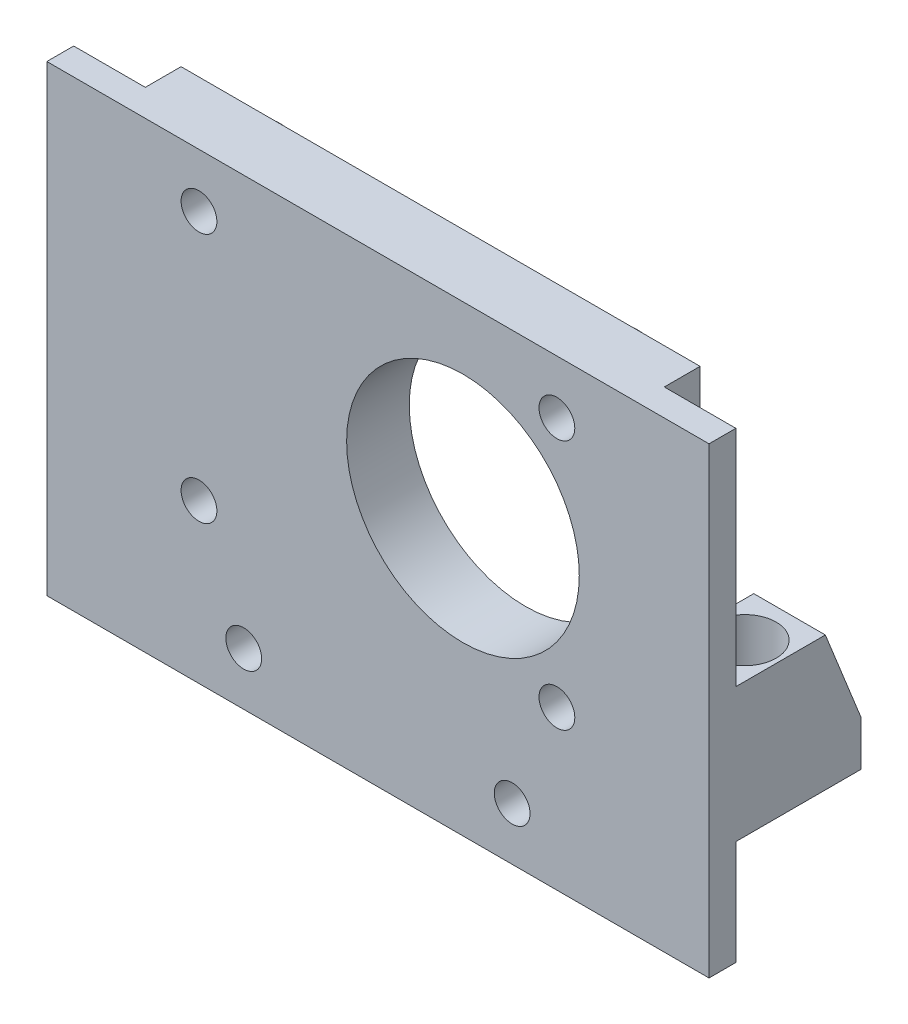
ISO-10303-21;
HEADER;
FILE_DESCRIPTION(('STEP AP214'),'2;1');
FILE_NAME('part.step','',(''),(''),'','','');
FILE_SCHEMA(('AUTOMOTIVE_DESIGN { 1 0 10303 214 1 1 1 1 }'));
ENDSEC;
DATA;
#1=APPLICATION_CONTEXT('core data for automotive mechanical design processes');
#2=APPLICATION_PROTOCOL_DEFINITION('international standard','automotive_design',2000,#1);
#3=PRODUCT_CONTEXT('',#1,'mechanical');
#4=PRODUCT('Part','Part','',(#3));
#5=PRODUCT_RELATED_PRODUCT_CATEGORY('part','',(#4));
#6=PRODUCT_DEFINITION_FORMATION('','',#4);
#7=PRODUCT_DEFINITION_CONTEXT('part definition',#1,'design');
#8=PRODUCT_DEFINITION('design','',#6,#7);
#9=PRODUCT_DEFINITION_SHAPE('','',#8);
#10=(LENGTH_UNIT() NAMED_UNIT(*) SI_UNIT(.MILLI.,.METRE.));
#11=(NAMED_UNIT(*) PLANE_ANGLE_UNIT() SI_UNIT($,.RADIAN.));
#12=(NAMED_UNIT(*) SI_UNIT($,.STERADIAN.) SOLID_ANGLE_UNIT());
#13=UNCERTAINTY_MEASURE_WITH_UNIT(LENGTH_MEASURE(1.E-05),#10,'distance_accuracy_value','');
#14=(GEOMETRIC_REPRESENTATION_CONTEXT(3) GLOBAL_UNCERTAINTY_ASSIGNED_CONTEXT((#13)) GLOBAL_UNIT_ASSIGNED_CONTEXT((#10,
#11,#12)) REPRESENTATION_CONTEXT('',''));
#15=CARTESIAN_POINT('',(0.,0.,0.));
#16=DIRECTION('',(0.,0.,1.));
#17=DIRECTION('',(1.,0.,0.));
#18=AXIS2_PLACEMENT_3D('',#15,#16,#17);
#19=CARTESIAN_POINT('',(0.,1.83595020953031,0.));
#20=DIRECTION('',(0.,-1.,0.));
#21=DIRECTION('',(0.,0.,-1.));
#22=AXIS2_PLACEMENT_3D('',#19,#20,#21);
#23=PLANE('',#22);
#24=CARTESIAN_POINT('',(-4.,1.83595020953031,1.03844798598296));
#25=DIRECTION('',(0.,-1.,0.));
#26=DIRECTION('',(0.,0.,-1.));
#27=AXIS2_PLACEMENT_3D('',#24,#25,#26);
#28=CIRCLE('',#27,2.);
#29=CARTESIAN_POINT('',(-4.,1.83595020953031,-0.961552014017035));
#30=VERTEX_POINT('',#29);
#31=EDGE_CURVE('E205',#30,#30,#28,.F.);
#32=ORIENTED_EDGE('',*,*,#31,.T.);
#33=EDGE_LOOP('',(#32));
#34=FACE_BOUND('',#33,.T.);
#35=DIRECTION('',(0.,0.,-1.));
#36=VECTOR('',#35,1.);
#37=CARTESIAN_POINT('',(0.,1.83595020953031,-1.96155201401704));
#38=LINE('',#37,#36);
#39=CARTESIAN_POINT('',(0.,1.83595020953031,2.03844798598298));
#40=VERTEX_POINT('',#39);
#41=CARTESIAN_POINT('',(0.,1.83595020953031,-3.96155201401702));
#42=VERTEX_POINT('',#41);
#43=EDGE_CURVE('E198',#40,#42,#38,.T.);
#44=ORIENTED_EDGE('',*,*,#43,.F.);
#45=DIRECTION('',(1.,0.,0.));
#46=VECTOR('',#45,1.);
#47=CARTESIAN_POINT('',(0.,1.83595020953034,2.03844798598298));
#48=LINE('',#47,#46);
#49=CARTESIAN_POINT('',(58.,1.83595020953031,2.03844798598298));
#50=VERTEX_POINT('',#49);
#51=EDGE_CURVE('E229',#40,#50,#48,.T.);
#52=ORIENTED_EDGE('',*,*,#51,.T.);
#53=DIRECTION('',(0.,0.,1.));
#54=VECTOR('',#53,1.);
#55=CARTESIAN_POINT('',(58.,1.83595020953031,6.03844798598335));
#56=LINE('',#55,#54);
#57=CARTESIAN_POINT('',(58.,1.83595020953031,-7.96155201401704));
#58=VERTEX_POINT('',#57);
#59=EDGE_CURVE('E296',#58,#50,#56,.T.);
#60=ORIENTED_EDGE('',*,*,#59,.F.);
#61=DIRECTION('',(-1.,0.,0.));
#62=VECTOR('',#61,1.);
#63=CARTESIAN_POINT('',(58.,1.83595020953031,-7.96155201401704));
#64=LINE('',#63,#62);
#65=CARTESIAN_POINT('',(66.,1.83595020953031,-7.96155201401704));
#66=VERTEX_POINT('',#65);
#67=EDGE_CURVE('E301',#66,#58,#64,.T.);
#68=ORIENTED_EDGE('',*,*,#67,.F.);
#69=DIRECTION('',(0.,0.,-1.));
#70=VECTOR('',#69,1.);
#71=CARTESIAN_POINT('',(66.,1.83595020953031,6.03844798598296));
#72=LINE('',#71,#70);
#73=CARTESIAN_POINT('',(66.,1.83595020953031,6.03844798598296));
#74=VERTEX_POINT('',#73);
#75=EDGE_CURVE('E304',#74,#66,#72,.T.);
#76=ORIENTED_EDGE('',*,*,#75,.F.);
#77=DIRECTION('',(1.,0.,0.));
#78=VECTOR('',#77,1.);
#79=CARTESIAN_POINT('',(0.,1.83595020953031,6.03844798598335));
#80=LINE('',#79,#78);
#81=CARTESIAN_POINT('',(-8.00000000000001,1.83595020953031,6.03844798598298));
#82=VERTEX_POINT('',#81);
#83=EDGE_CURVE('E314',#82,#74,#80,.T.);
#84=ORIENTED_EDGE('',*,*,#83,.F.);
#85=DIRECTION('',(0.,0.,1.));
#86=VECTOR('',#85,1.);
#87=CARTESIAN_POINT('',(-8.,1.83595020953031,-1.96155201401704));
#88=LINE('',#87,#86);
#89=CARTESIAN_POINT('',(-8.00000000000001,1.83595020953031,-3.96155201401702));
#90=VERTEX_POINT('',#89);
#91=EDGE_CURVE('E316',#90,#82,#88,.T.);
#92=ORIENTED_EDGE('',*,*,#91,.F.);
#93=DIRECTION('',(-1.,0.,0.));
#94=VECTOR('',#93,1.);
#95=CARTESIAN_POINT('',(0.,1.83595020953031,-3.96155201401702));
#96=LINE('',#95,#94);
#97=EDGE_CURVE('E194',#42,#90,#96,.T.);
#98=ORIENTED_EDGE('',*,*,#97,.F.);
#99=EDGE_LOOP('',(#44,#52,#60,#68,#76,#84,#92,#98));
#100=FACE_BOUND('',#99,.T.);
#101=CARTESIAN_POINT('',(62.0000000000001,1.83595020953031,1.03844798598296));
#102=DIRECTION('',(0.,1.,0.));
#103=DIRECTION('',(0.,0.,1.));
#104=AXIS2_PLACEMENT_3D('',#101,#102,#103);
#105=CIRCLE('',#104,2.);
#106=CARTESIAN_POINT('',(62.0000000000001,1.83595020953031,3.03844798598295));
#107=VERTEX_POINT('',#106);
#108=EDGE_CURVE('E293',#107,#107,#105,.T.);
#109=ORIENTED_EDGE('',*,*,#108,.T.);
#110=EDGE_LOOP('',(#109));
#111=FACE_BOUND('',#110,.T.);
#112=ADVANCED_FACE('F47',(#34,#100,#111),#23,.T.);
#113=CARTESIAN_POINT('',(58.,6.83595020953031,6.03844798598335));
#114=DIRECTION('',(1.,0.,0.));
#115=DIRECTION('',(0.,0.,-1.));
#116=AXIS2_PLACEMENT_3D('',#113,#114,#115);
#117=PLANE('',#116);
#118=DIRECTION('',(0.,0.,1.));
#119=VECTOR('',#118,1.);
#120=CARTESIAN_POINT('',(57.9999999999997,16.8359502095296,6.03844798598298));
#121=LINE('',#120,#119);
#122=CARTESIAN_POINT('',(57.9999999999997,16.8359502095296,-3.96155201401724));
#123=VERTEX_POINT('',#122);
#124=CARTESIAN_POINT('',(58.,16.8359502095296,2.03844798598298));
#125=VERTEX_POINT('',#124);
#126=EDGE_CURVE('E212',#123,#125,#121,.T.);
#127=ORIENTED_EDGE('',*,*,#126,.F.);
#128=DIRECTION('',(0.,-0.928476690885257,-0.371390676354111));
#129=VECTOR('',#128,1.);
#130=CARTESIAN_POINT('',(58.,6.83595020953031,-7.96155201401704));
#131=LINE('',#130,#129);
#132=CARTESIAN_POINT('',(58.,6.83595020953031,-7.96155201401704));
#133=VERTEX_POINT('',#132);
#134=EDGE_CURVE('E278',#123,#133,#131,.T.);
#135=ORIENTED_EDGE('',*,*,#134,.T.);
#136=DIRECTION('',(0.,-1.,0.));
#137=VECTOR('',#136,1.);
#138=CARTESIAN_POINT('',(58.,6.83595020953031,-7.96155201401704));
#139=LINE('',#138,#137);
#140=EDGE_CURVE('E300',#133,#58,#139,.T.);
#141=ORIENTED_EDGE('',*,*,#140,.T.);
#142=ORIENTED_EDGE('',*,*,#59,.T.);
#143=DIRECTION('',(0.,1.,0.));
#144=VECTOR('',#143,1.);
#145=CARTESIAN_POINT('',(58.,0.,2.03844798598298));
#146=LINE('',#145,#144);
#147=EDGE_CURVE('E232',#50,#125,#146,.T.);
#148=ORIENTED_EDGE('',*,*,#147,.T.);
#149=EDGE_LOOP('',(#127,#135,#141,#142,#148));
#150=FACE_BOUND('',#149,.T.);
#151=ADVANCED_FACE('F408',(#150),#117,.F.);
#152=CARTESIAN_POINT('',(20.3038463500591,6.83595020953031,-7.96155201401704));
#153=DIRECTION('',(0.,0.371390676354111,-0.928476690885257));
#154=DIRECTION('',(0.,0.928476690885257,0.371390676354111));
#155=AXIS2_PLACEMENT_3D('',#152,#153,#154);
#156=PLANE('',#155);
#157=ORIENTED_EDGE('',*,*,#134,.F.);
#158=DIRECTION('',(1.,0.,0.));
#159=VECTOR('',#158,1.);
#160=CARTESIAN_POINT('',(20.3038463500591,16.8359502095296,-3.96155201401724));
#161=LINE('',#160,#159);
#162=CARTESIAN_POINT('',(66.,16.8359502095296,-3.96155201401724));
#163=VERTEX_POINT('',#162);
#164=EDGE_CURVE('E221',#123,#163,#161,.T.);
#165=ORIENTED_EDGE('',*,*,#164,.T.);
#166=DIRECTION('',(0.,0.928476690885257,0.371390676354111));
#167=VECTOR('',#166,1.);
#168=CARTESIAN_POINT('',(66.,6.83595020953031,-7.96155201401704));
#169=LINE('',#168,#167);
#170=CARTESIAN_POINT('',(66.,6.83595020953031,-7.96155201401704));
#171=VERTEX_POINT('',#170);
#172=EDGE_CURVE('E267',#171,#163,#169,.T.);
#173=ORIENTED_EDGE('',*,*,#172,.F.);
#174=DIRECTION('',(-1.,0.,0.));
#175=VECTOR('',#174,1.);
#176=CARTESIAN_POINT('',(58.,6.83595020953031,-7.96155201401704));
#177=LINE('',#176,#175);
#178=EDGE_CURVE('E297',#171,#133,#177,.T.);
#179=ORIENTED_EDGE('',*,*,#178,.T.);
#180=EDGE_LOOP('',(#157,#165,#173,#179));
#181=FACE_BOUND('',#180,.T.);
#182=ADVANCED_FACE('F414',(#181),#156,.T.);
#183=CARTESIAN_POINT('',(62.0000000000001,41.8359502095296,1.03844798598296));
#184=DIRECTION('',(0.,-1.,0.));
#185=DIRECTION('',(0.,0.,-1.));
#186=AXIS2_PLACEMENT_3D('',#183,#184,#185);
#187=CYLINDRICAL_SURFACE('',#186,3.50000000000001);
#188=CARTESIAN_POINT('',(62.0000000000001,7.83595020953031,1.03844798598296));
#189=DIRECTION('',(0.,-1.,0.));
#190=DIRECTION('',(0.,0.,-1.));
#191=AXIS2_PLACEMENT_3D('',#188,#189,#190);
#192=CIRCLE('',#191,3.50000000000001);
#193=CARTESIAN_POINT('',(62.0000000000001,7.83595020953031,-2.46155201401705));
#194=VERTEX_POINT('',#193);
#195=EDGE_CURVE('E256',#194,#194,#192,.T.);
#196=ORIENTED_EDGE('',*,*,#195,.T.);
#197=EDGE_LOOP('',(#196));
#198=FACE_BOUND('',#197,.T.);
#199=CARTESIAN_POINT('',(62.0000000000001,16.8359502095296,1.03844798598296));
#200=DIRECTION('',(0.,1.,0.));
#201=DIRECTION('',(0.,0.,1.));
#202=AXIS2_PLACEMENT_3D('',#199,#200,#201);
#203=CIRCLE('',#202,3.50000000000001);
#204=CARTESIAN_POINT('',(62.0000000000001,16.8359502095296,4.53844798598296));
#205=VERTEX_POINT('',#204);
#206=EDGE_CURVE('E51',#205,#205,#203,.F.);
#207=ORIENTED_EDGE('',*,*,#206,.F.);
#208=EDGE_LOOP('',(#207));
#209=FACE_BOUND('',#208,.T.);
#210=ADVANCED_FACE('F540',(#198,#209),#187,.F.);
#211=CARTESIAN_POINT('',(0.,0.,6.03844798598298));
#212=DIRECTION('',(0.,0.,1.));
#213=DIRECTION('',(1.,0.,0.));
#214=AXIS2_PLACEMENT_3D('',#211,#212,#213);
#215=PLANE('',#214);
#216=DIRECTION('',(1.,0.,0.));
#217=VECTOR('',#216,1.);
#218=CARTESIAN_POINT('',(0.,41.8359502095296,6.03844798598298));
#219=LINE('',#218,#217);
#220=CARTESIAN_POINT('',(-8.00000000000001,41.8359502095296,6.03844798598298));
#221=VERTEX_POINT('',#220);
#222=CARTESIAN_POINT('',(0.,41.8359502095296,6.03844798598298));
#223=VERTEX_POINT('',#222);
#224=EDGE_CURVE('E355',#221,#223,#219,.T.);
#225=ORIENTED_EDGE('',*,*,#224,.T.);
#226=DIRECTION('',(0.,1.,0.));
#227=VECTOR('',#226,1.);
#228=CARTESIAN_POINT('',(0.,0.,6.03844798598298));
#229=LINE('',#228,#227);
#230=CARTESIAN_POINT('',(0.,14.993789145251,6.03844798598298));
#231=VERTEX_POINT('',#230);
#232=EDGE_CURVE('E71',#231,#223,#229,.T.);
#233=ORIENTED_EDGE('',*,*,#232,.F.);
#234=DIRECTION('',(-1.,0.,0.));
#235=VECTOR('',#234,1.);
#236=CARTESIAN_POINT('',(11.4258625976842,14.993789145251,6.03844798598297));
#237=LINE('',#236,#235);
#238=CARTESIAN_POINT('',(-8.00000000000001,14.993789145251,6.03844798598298));
#239=VERTEX_POINT('',#238);
#240=EDGE_CURVE('E272',#231,#239,#237,.T.);
#241=ORIENTED_EDGE('',*,*,#240,.T.);
#242=DIRECTION('',(0.,1.,0.));
#243=VECTOR('',#242,1.);
#244=CARTESIAN_POINT('',(-8.00000000000001,0.,6.03844798598298));
#245=LINE('',#244,#243);
#246=EDGE_CURVE('E357',#239,#221,#245,.T.);
#247=ORIENTED_EDGE('',*,*,#246,.T.);
#248=EDGE_LOOP('',(#225,#233,#241,#247));
#249=FACE_BOUND('',#248,.T.);
#250=ADVANCED_FACE('F401',(#249),#215,.F.);
#251=CARTESIAN_POINT('',(49.,35.8359502095322,17.3521564849678));
#252=DIRECTION('',(0.,0.,-1.));
#253=DIRECTION('',(-1.,0.,0.));
#254=AXIS2_PLACEMENT_3D('',#251,#252,#253);
#255=CYLINDRICAL_SURFACE('',#254,4.00000000000001);
#256=CARTESIAN_POINT('',(49.,35.8359502095322,0.));
#257=DIRECTION('',(0.,0.,1.));
#258=DIRECTION('',(1.,0.,0.));
#259=AXIS2_PLACEMENT_3D('',#256,#257,#258);
#260=CIRCLE('',#259,4.00000000000001);
#261=CARTESIAN_POINT('',(53.,35.8359502095322,0.));
#262=VERTEX_POINT('',#261);
#263=EDGE_CURVE('E370',#262,#262,#260,.T.);
#264=ORIENTED_EDGE('',*,*,#263,.T.);
#265=EDGE_LOOP('',(#264));
#266=FACE_BOUND('',#265,.T.);
#267=CARTESIAN_POINT('',(49.,35.8359502095322,2.03844798598298));
#268=DIRECTION('',(0.,0.,1.));
#269=DIRECTION('',(1.,0.,0.));
#270=AXIS2_PLACEMENT_3D('',#267,#268,#269);
#271=CIRCLE('',#270,4.00000000000001);
#272=CARTESIAN_POINT('',(53.,35.8359502095322,2.03844798598298));
#273=VERTEX_POINT('',#272);
#274=EDGE_CURVE('E12',#273,#273,#271,.T.);
#275=ORIENTED_EDGE('',*,*,#274,.F.);
#276=EDGE_LOOP('',(#275));
#277=FACE_BOUND('',#276,.T.);
#278=ADVANCED_FACE('F49',(#266,#277),#255,.T.);
#279=CARTESIAN_POINT('',(0.,6.83595020953031,-1.96155201401704));
#280=DIRECTION('',(-1.,0.,0.));
#281=DIRECTION('',(0.,0.,1.));
#282=AXIS2_PLACEMENT_3D('',#279,#280,#281);
#283=PLANE('',#282);
#284=DIRECTION('',(0.,0.713980136377104,0.700165955226996));
#285=VECTOR('',#284,1.);
#286=CARTESIAN_POINT('',(0.,6.83595020953031,-1.96155201401703));
#287=LINE('',#286,#285);
#288=CARTESIAN_POINT('',(0.,6.83595020953031,-1.96155201401704));
#289=VERTEX_POINT('',#288);
#290=CARTESIAN_POINT('',(0.,10.9148696773906,2.03844798598298));
#291=VERTEX_POINT('',#290);
#292=EDGE_CURVE('E265',#289,#291,#287,.T.);
#293=ORIENTED_EDGE('',*,*,#292,.T.);
#294=DIRECTION('',(0.,1.,0.));
#295=VECTOR('',#294,1.);
#296=CARTESIAN_POINT('',(0.,6.83595020953031,2.03844798598298));
#297=LINE('',#296,#295);
#298=EDGE_CURVE('E242',#40,#291,#297,.T.);
#299=ORIENTED_EDGE('',*,*,#298,.F.);
#300=ORIENTED_EDGE('',*,*,#43,.T.);
#301=DIRECTION('',(0.,-1.,0.));
#302=VECTOR('',#301,1.);
#303=CARTESIAN_POINT('',(0.,1.83595020953031,-3.96155201401702));
#304=LINE('',#303,#302);
#305=CARTESIAN_POINT('',(0.,6.83595020953031,-3.96155201401702));
#306=VERTEX_POINT('',#305);
#307=EDGE_CURVE('E186',#306,#42,#304,.T.);
#308=ORIENTED_EDGE('',*,*,#307,.F.);
#309=DIRECTION('',(0.,0.,-1.));
#310=VECTOR('',#309,1.);
#311=CARTESIAN_POINT('',(0.,6.83595020953031,6.03844798598298));
#312=LINE('',#311,#310);
#313=EDGE_CURVE('E175',#289,#306,#312,.T.);
#314=ORIENTED_EDGE('',*,*,#313,.F.);
#315=EDGE_LOOP('',(#293,#299,#300,#308,#314));
#316=FACE_BOUND('',#315,.T.);
#317=ADVANCED_FACE('F196',(#316),#283,.F.);
#318=CARTESIAN_POINT('',(-4.,6.83595020953031,1.03844798598296));
#319=DIRECTION('',(0.,-1.,0.));
#320=DIRECTION('',(0.,0.,-1.));
#321=AXIS2_PLACEMENT_3D('',#318,#319,#320);
#322=CYLINDRICAL_SURFACE('',#321,2.);
#323=CARTESIAN_POINT('',(-4.,7.83595020953031,1.03844798598296));
#324=DIRECTION('',(0.,-1.,0.));
#325=DIRECTION('',(0.,0.,-1.));
#326=AXIS2_PLACEMENT_3D('',#323,#324,#325);
#327=CIRCLE('',#326,2.);
#328=CARTESIAN_POINT('',(-4.,7.83595020953031,-0.961552014017035));
#329=VERTEX_POINT('',#328);
#330=EDGE_CURVE('E259',#329,#329,#327,.T.);
#331=ORIENTED_EDGE('',*,*,#330,.F.);
#332=EDGE_LOOP('',(#331));
#333=FACE_BOUND('',#332,.T.);
#334=ORIENTED_EDGE('',*,*,#31,.F.);
#335=EDGE_LOOP('',(#334));
#336=FACE_BOUND('',#335,.T.);
#337=ADVANCED_FACE('F391',(#333,#336),#322,.F.);
#338=CARTESIAN_POINT('',(62.0000000000001,6.83595020953031,1.03844798598296));
#339=DIRECTION('',(0.,-1.,0.));
#340=DIRECTION('',(0.,0.,-1.));
#341=AXIS2_PLACEMENT_3D('',#338,#339,#340);
#342=CYLINDRICAL_SURFACE('',#341,2.);
#343=ORIENTED_EDGE('',*,*,#108,.F.);
#344=EDGE_LOOP('',(#343));
#345=FACE_BOUND('',#344,.T.);
#346=CARTESIAN_POINT('',(62.0000000000001,7.83595020953031,1.03844798598296));
#347=DIRECTION('',(0.,-1.,0.));
#348=DIRECTION('',(0.,0.,-1.));
#349=AXIS2_PLACEMENT_3D('',#346,#347,#348);
#350=CIRCLE('',#349,2.);
#351=CARTESIAN_POINT('',(62.0000000000001,7.83595020953031,-0.961552014017039));
#352=VERTEX_POINT('',#351);
#353=EDGE_CURVE('E264',#352,#352,#350,.T.);
#354=ORIENTED_EDGE('',*,*,#353,.F.);
#355=EDGE_LOOP('',(#354));
#356=FACE_BOUND('',#355,.T.);
#357=ADVANCED_FACE('F388',(#345,#356),#342,.F.);
#358=CARTESIAN_POINT('',(44.,-3.96404979046968,6.03844798598298));
#359=DIRECTION('',(0.,0.,1.));
#360=DIRECTION('',(1.,0.,0.));
#361=AXIS2_PLACEMENT_3D('',#358,#359,#360);
#362=CIRCLE('',#361,2.);
#363=CARTESIAN_POINT('',(46.,-3.96404979046968,6.03844798598298));
#364=VERTEX_POINT('',#363);
#365=EDGE_CURVE('E982',#364,#364,#362,.T.);
#366=ORIENTED_EDGE('',*,*,#365,.T.);
#367=EDGE_LOOP('',(#366));
#368=FACE_BOUND('',#367,.T.);
#369=CARTESIAN_POINT('',(14.,-3.96404979046969,6.03844798598298));
#370=DIRECTION('',(0.,0.,1.));
#371=DIRECTION('',(1.,0.,0.));
#372=AXIS2_PLACEMENT_3D('',#369,#370,#371);
#373=CIRCLE('',#372,2.);
#374=CARTESIAN_POINT('',(16.,-3.96404979046969,6.03844798598298));
#375=VERTEX_POINT('',#374);
#376=EDGE_CURVE('E983',#375,#375,#373,.T.);
#377=ORIENTED_EDGE('',*,*,#376,.T.);
#378=EDGE_LOOP('',(#377));
#379=FACE_BOUND('',#378,.T.);
#380=ORIENTED_EDGE('',*,*,#83,.T.);
#381=DIRECTION('',(0.,1.,0.));
#382=VECTOR('',#381,1.);
#383=CARTESIAN_POINT('',(66.,0.,6.03844798598298));
#384=LINE('',#383,#382);
#385=CARTESIAN_POINT('',(66.,-9.86404979046969,6.03844798598298));
#386=VERTEX_POINT('',#385);
#387=EDGE_CURVE('E352',#386,#74,#384,.T.);
#388=ORIENTED_EDGE('',*,*,#387,.F.);
#389=DIRECTION('',(1.,0.,0.));
#390=VECTOR('',#389,1.);
#391=CARTESIAN_POINT('',(0.,-9.86404979046969,6.03844798598298));
#392=LINE('',#391,#390);
#393=CARTESIAN_POINT('',(-8.,-9.86404979046969,6.03844798598298));
#394=VERTEX_POINT('',#393);
#395=EDGE_CURVE('E336',#394,#386,#392,.T.);
#396=ORIENTED_EDGE('',*,*,#395,.F.);
#397=EDGE_CURVE('E341',#394,#82,#245,.T.);
#398=ORIENTED_EDGE('',*,*,#397,.T.);
#399=EDGE_LOOP('',(#380,#388,#396,#398));
#400=FACE_BOUND('',#399,.T.);
#401=ADVANCED_FACE('F390',(#368,#379,#400),#215,.F.);
#402=CARTESIAN_POINT('',(49.,35.8359502095322,17.3521564849678));
#403=DIRECTION('',(0.,0.,-1.));
#404=DIRECTION('',(-1.,0.,0.));
#405=AXIS2_PLACEMENT_3D('',#402,#403,#404);
#406=CYLINDRICAL_SURFACE('',#405,2.);
#407=CARTESIAN_POINT('',(49.,35.8359502095322,0.));
#408=DIRECTION('',(0.,0.,1.));
#409=DIRECTION('',(1.,0.,0.));
#410=AXIS2_PLACEMENT_3D('',#407,#408,#409);
#411=CIRCLE('',#410,2.);
#412=CARTESIAN_POINT('',(51.,35.8359502095322,0.));
#413=VERTEX_POINT('',#412);
#414=EDGE_CURVE('E373',#413,#413,#411,.T.);
#415=ORIENTED_EDGE('',*,*,#414,.F.);
#416=EDGE_LOOP('',(#415));
#417=FACE_BOUND('',#416,.T.);
#418=CARTESIAN_POINT('',(49.,35.8359502095322,9.03844798598298));
#419=DIRECTION('',(0.,0.,1.));
#420=DIRECTION('',(1.,0.,0.));
#421=AXIS2_PLACEMENT_3D('',#418,#419,#420);
#422=CIRCLE('',#421,2.);
#423=CARTESIAN_POINT('',(51.,35.8359502095322,9.03844798598298));
#424=VERTEX_POINT('',#423);
#425=EDGE_CURVE('E289',#424,#424,#422,.F.);
#426=ORIENTED_EDGE('',*,*,#425,.F.);
#427=EDGE_LOOP('',(#426));
#428=FACE_BOUND('',#427,.T.);
#429=ADVANCED_FACE('F398',(#417,#428),#406,.F.);
#430=CARTESIAN_POINT('',(0.,0.,0.));
#431=DIRECTION('',(0.,0.,1.));
#432=DIRECTION('',(1.,0.,0.));
#433=AXIS2_PLACEMENT_3D('',#430,#431,#432);
#434=PLANE('',#433);
#435=ORIENTED_EDGE('',*,*,#414,.T.);
#436=EDGE_LOOP('',(#435));
#437=FACE_BOUND('',#436,.T.);
#438=ORIENTED_EDGE('',*,*,#263,.F.);
#439=EDGE_LOOP('',(#438));
#440=FACE_BOUND('',#439,.T.);
#441=ADVANCED_FACE('F465',(#437,#440),#434,.F.);
#442=CARTESIAN_POINT('',(0.,0.,9.03844798598298));
#443=DIRECTION('',(0.,0.,1.));
#444=DIRECTION('',(1.,0.,0.));
#445=AXIS2_PLACEMENT_3D('',#442,#443,#444);
#446=PLANE('',#445);
#447=CARTESIAN_POINT('',(44.,-3.96404979046968,9.03844798598298));
#448=DIRECTION('',(0.,0.,1.));
#449=DIRECTION('',(1.,0.,0.));
#450=AXIS2_PLACEMENT_3D('',#447,#448,#449);
#451=CIRCLE('',#450,2.);
#452=CARTESIAN_POINT('',(46.,-3.96404979046968,9.03844798598298));
#453=VERTEX_POINT('',#452);
#454=EDGE_CURVE('E979',#453,#453,#451,.T.);
#455=ORIENTED_EDGE('',*,*,#454,.F.);
#456=EDGE_LOOP('',(#455));
#457=FACE_BOUND('',#456,.T.);
#458=CARTESIAN_POINT('',(14.,-3.96404979046969,9.03844798598298));
#459=DIRECTION('',(0.,0.,1.));
#460=DIRECTION('',(1.,0.,0.));
#461=AXIS2_PLACEMENT_3D('',#458,#459,#460);
#462=CIRCLE('',#461,2.);
#463=CARTESIAN_POINT('',(16.,-3.96404979046969,9.03844798598298));
#464=VERTEX_POINT('',#463);
#465=EDGE_CURVE('E988',#464,#464,#462,.T.);
#466=ORIENTED_EDGE('',*,*,#465,.F.);
#467=EDGE_LOOP('',(#466));
#468=FACE_BOUND('',#467,.T.);
#469=CARTESIAN_POINT('',(9.,7.8359502095322,9.03844798598298));
#470=DIRECTION('',(0.,0.,1.));
#471=DIRECTION('',(1.,0.,0.));
#472=AXIS2_PLACEMENT_3D('',#469,#470,#471);
#473=CIRCLE('',#472,2.);
#474=CARTESIAN_POINT('',(11.,7.8359502095322,9.03844798598298));
#475=VERTEX_POINT('',#474);
#476=EDGE_CURVE('E283',#475,#475,#473,.F.);
#477=ORIENTED_EDGE('',*,*,#476,.T.);
#478=EDGE_LOOP('',(#477));
#479=FACE_BOUND('',#478,.T.);
#480=CARTESIAN_POINT('',(49.,7.8359502095322,9.03844798598298));
#481=DIRECTION('',(0.,0.,1.));
#482=DIRECTION('',(1.,0.,0.));
#483=AXIS2_PLACEMENT_3D('',#480,#481,#482);
#484=CIRCLE('',#483,2.);
#485=CARTESIAN_POINT('',(51.,7.8359502095322,9.03844798598298));
#486=VERTEX_POINT('',#485);
#487=EDGE_CURVE('E286',#486,#486,#484,.F.);
#488=ORIENTED_EDGE('',*,*,#487,.T.);
#489=EDGE_LOOP('',(#488));
#490=FACE_BOUND('',#489,.T.);
#491=CARTESIAN_POINT('',(38.5,21.8359502095322,9.03844798598298));
#492=DIRECTION('',(0.,0.,1.));
#493=DIRECTION('',(1.,0.,0.));
#494=AXIS2_PLACEMENT_3D('',#491,#492,#493);
#495=CIRCLE('',#494,13.);
#496=CARTESIAN_POINT('',(51.5,21.8359502095322,9.03844798598298));
#497=VERTEX_POINT('',#496);
#498=EDGE_CURVE('E292',#497,#497,#495,.F.);
#499=ORIENTED_EDGE('',*,*,#498,.T.);
#500=EDGE_LOOP('',(#499));
#501=FACE_BOUND('',#500,.T.);
#502=ORIENTED_EDGE('',*,*,#425,.T.);
#503=EDGE_LOOP('',(#502));
#504=FACE_BOUND('',#503,.T.);
#505=CARTESIAN_POINT('',(9.,35.8359502095322,9.03844798598298));
#506=DIRECTION('',(0.,0.,1.));
#507=DIRECTION('',(1.,0.,0.));
#508=AXIS2_PLACEMENT_3D('',#505,#506,#507);
#509=CIRCLE('',#508,2.);
#510=CARTESIAN_POINT('',(11.,35.8359502095322,9.03844798598298));
#511=VERTEX_POINT('',#510);
#512=EDGE_CURVE('E280',#511,#511,#509,.F.);
#513=ORIENTED_EDGE('',*,*,#512,.T.);
#514=EDGE_LOOP('',(#513));
#515=FACE_BOUND('',#514,.T.);
#516=DIRECTION('',(1.,0.,0.));
#517=VECTOR('',#516,1.);
#518=CARTESIAN_POINT('',(0.,-9.86404979046969,9.03844798598298));
#519=LINE('',#518,#517);
#520=CARTESIAN_POINT('',(-8.,-9.86404979046969,9.03844798598298));
#521=VERTEX_POINT('',#520);
#522=CARTESIAN_POINT('',(66.,-9.86404979046969,9.03844798598298));
#523=VERTEX_POINT('',#522);
#524=EDGE_CURVE('E337',#521,#523,#519,.T.);
#525=ORIENTED_EDGE('',*,*,#524,.T.);
#526=DIRECTION('',(0.,1.,0.));
#527=VECTOR('',#526,1.);
#528=CARTESIAN_POINT('',(66.,0.,9.03844798598298));
#529=LINE('',#528,#527);
#530=CARTESIAN_POINT('',(66.,41.8359502095296,9.03844798598298));
#531=VERTEX_POINT('',#530);
#532=EDGE_CURVE('E340',#523,#531,#529,.T.);
#533=ORIENTED_EDGE('',*,*,#532,.T.);
#534=DIRECTION('',(1.,0.,0.));
#535=VECTOR('',#534,1.);
#536=CARTESIAN_POINT('',(0.,41.8359502095296,9.03844798598298));
#537=LINE('',#536,#535);
#538=CARTESIAN_POINT('',(-8.00000000000001,41.8359502095296,9.03844798598298));
#539=VERTEX_POINT('',#538);
#540=EDGE_CURVE('E343',#539,#531,#537,.T.);
#541=ORIENTED_EDGE('',*,*,#540,.F.);
#542=DIRECTION('',(0.,1.,0.));
#543=VECTOR('',#542,1.);
#544=CARTESIAN_POINT('',(-8.00000000000001,0.,9.03844798598298));
#545=LINE('',#544,#543);
#546=EDGE_CURVE('E346',#521,#539,#545,.T.);
#547=ORIENTED_EDGE('',*,*,#546,.F.);
#548=EDGE_LOOP('',(#525,#533,#541,#547));
#549=FACE_BOUND('',#548,.T.);
#550=ADVANCED_FACE('F462',(#457,#468,#479,#490,#501,#504,#515,#549),#446,.T.);
#551=CARTESIAN_POINT('',(-8.00000000000001,0.,9.03844798598298));
#552=DIRECTION('',(-1.,0.,0.));
#553=DIRECTION('',(0.,0.,1.));
#554=AXIS2_PLACEMENT_3D('',#551,#552,#553);
#555=PLANE('',#554);
#556=ORIENTED_EDGE('',*,*,#91,.T.);
#557=ORIENTED_EDGE('',*,*,#397,.F.);
#558=DIRECTION('',(0.,0.,-1.));
#559=VECTOR('',#558,1.);
#560=CARTESIAN_POINT('',(-8.,-9.86404979046969,9.03844798598298));
#561=LINE('',#560,#559);
#562=EDGE_CURVE('E349',#521,#394,#561,.T.);
#563=ORIENTED_EDGE('',*,*,#562,.F.);
#564=ORIENTED_EDGE('',*,*,#546,.T.);
#565=DIRECTION('',(0.,0.,-1.));
#566=VECTOR('',#565,1.);
#567=CARTESIAN_POINT('',(-8.00000000000001,41.8359502095296,9.03844798598298));
#568=LINE('',#567,#566);
#569=EDGE_CURVE('E361',#539,#221,#568,.T.);
#570=ORIENTED_EDGE('',*,*,#569,.T.);
#571=ORIENTED_EDGE('',*,*,#246,.F.);
#572=DIRECTION('',(0.,-0.713980136377104,-0.700165955226996));
#573=VECTOR('',#572,1.);
#574=CARTESIAN_POINT('',(-8.00000000000001,6.83595020953031,-1.96155201401704));
#575=LINE('',#574,#573);
#576=CARTESIAN_POINT('',(-8.00000000000001,6.83595020953031,-1.96155201401704));
#577=VERTEX_POINT('',#576);
#578=EDGE_CURVE('E269',#239,#577,#575,.T.);
#579=ORIENTED_EDGE('',*,*,#578,.T.);
#580=DIRECTION('',(0.,0.,-1.));
#581=VECTOR('',#580,1.);
#582=CARTESIAN_POINT('',(-8.00000000000001,6.83595020953031,6.03844798598298));
#583=LINE('',#582,#581);
#584=CARTESIAN_POINT('',(-8.00000000000001,6.83595020953031,-3.96155201401702));
#585=VERTEX_POINT('',#584);
#586=EDGE_CURVE('E203',#577,#585,#583,.T.);
#587=ORIENTED_EDGE('',*,*,#586,.T.);
#588=DIRECTION('',(0.,-1.,0.));
#589=VECTOR('',#588,1.);
#590=CARTESIAN_POINT('',(-8.00000000000001,1.83595020953031,-3.96155201401702));
#591=LINE('',#590,#589);
#592=EDGE_CURVE('E187',#585,#90,#591,.T.);
#593=ORIENTED_EDGE('',*,*,#592,.T.);
#594=EDGE_LOOP('',(#556,#557,#563,#564,#570,#571,#579,#587,#593));
#595=FACE_BOUND('',#594,.T.);
#596=ADVANCED_FACE('F464',(#595),#555,.T.);
#597=CARTESIAN_POINT('',(0.,41.8359502095296,9.03844798598298));
#598=DIRECTION('',(0.,1.,0.));
#599=DIRECTION('',(0.,0.,1.));
#600=AXIS2_PLACEMENT_3D('',#597,#598,#599);
#601=PLANE('',#600);
#602=ORIENTED_EDGE('',*,*,#224,.F.);
#603=ORIENTED_EDGE('',*,*,#569,.F.);
#604=ORIENTED_EDGE('',*,*,#540,.T.);
#605=DIRECTION('',(0.,0.,-1.));
#606=VECTOR('',#605,1.);
#607=CARTESIAN_POINT('',(66.,41.8359502095296,9.03844798598298));
#608=LINE('',#607,#606);
#609=CARTESIAN_POINT('',(66.,41.8359502095296,6.03844798598298));
#610=VERTEX_POINT('',#609);
#611=EDGE_CURVE('E364',#531,#610,#608,.T.);
#612=ORIENTED_EDGE('',*,*,#611,.T.);
#613=DIRECTION('',(1.,0.,0.));
#614=VECTOR('',#613,1.);
#615=CARTESIAN_POINT('',(20.3038463500591,41.8359502095296,6.03844798598298));
#616=LINE('',#615,#614);
#617=CARTESIAN_POINT('',(57.9999999999997,41.8359502095296,6.03844798598298));
#618=VERTEX_POINT('',#617);
#619=EDGE_CURVE('E276',#618,#610,#616,.T.);
#620=ORIENTED_EDGE('',*,*,#619,.F.);
#621=DIRECTION('',(0.,0.,1.));
#622=VECTOR('',#621,1.);
#623=CARTESIAN_POINT('',(58.,41.8359502095296,2.03844798598298));
#624=LINE('',#623,#622);
#625=CARTESIAN_POINT('',(58.,41.8359502095296,2.03844798598298));
#626=VERTEX_POINT('',#625);
#627=EDGE_CURVE('E237',#626,#618,#624,.T.);
#628=ORIENTED_EDGE('',*,*,#627,.F.);
#629=DIRECTION('',(1.,0.,0.));
#630=VECTOR('',#629,1.);
#631=CARTESIAN_POINT('',(0.,41.8359502095296,2.03844798598298));
#632=LINE('',#631,#630);
#633=CARTESIAN_POINT('',(0.,41.8359502095296,2.03844798598298));
#634=VERTEX_POINT('',#633);
#635=EDGE_CURVE('E235',#634,#626,#632,.T.);
#636=ORIENTED_EDGE('',*,*,#635,.F.);
#637=DIRECTION('',(0.,0.,1.));
#638=VECTOR('',#637,1.);
#639=CARTESIAN_POINT('',(0.,41.8359502095296,2.03844798598298));
#640=LINE('',#639,#638);
#641=EDGE_CURVE('E239',#634,#223,#640,.T.);
#642=ORIENTED_EDGE('',*,*,#641,.T.);
#643=EDGE_LOOP('',(#602,#603,#604,#612,#620,#628,#636,#642));
#644=FACE_BOUND('',#643,.T.);
#645=ADVANCED_FACE('F470',(#644),#601,.T.);
#646=CARTESIAN_POINT('',(66.,0.,9.03844798598298));
#647=DIRECTION('',(-1.,0.,0.));
#648=DIRECTION('',(0.,0.,1.));
#649=AXIS2_PLACEMENT_3D('',#646,#647,#648);
#650=PLANE('',#649);
#651=DIRECTION('',(0.,0.,-1.));
#652=VECTOR('',#651,1.);
#653=CARTESIAN_POINT('',(66.,16.8359502095296,6.03844798598298));
#654=LINE('',#653,#652);
#655=CARTESIAN_POINT('',(66.,16.8359502095296,6.03844798598298));
#656=VERTEX_POINT('',#655);
#657=EDGE_CURVE('E207',#656,#163,#654,.T.);
#658=ORIENTED_EDGE('',*,*,#657,.F.);
#659=DIRECTION('',(0.,1.,0.));
#660=VECTOR('',#659,1.);
#661=CARTESIAN_POINT('',(66.,16.8359502095296,6.03844798598298));
#662=LINE('',#661,#660);
#663=EDGE_CURVE('E217',#656,#610,#662,.T.);
#664=ORIENTED_EDGE('',*,*,#663,.T.);
#665=ORIENTED_EDGE('',*,*,#611,.F.);
#666=ORIENTED_EDGE('',*,*,#532,.F.);
#667=DIRECTION('',(0.,0.,-1.));
#668=VECTOR('',#667,1.);
#669=CARTESIAN_POINT('',(66.,-9.86404979046969,9.03844798598298));
#670=LINE('',#669,#668);
#671=EDGE_CURVE('E367',#523,#386,#670,.T.);
#672=ORIENTED_EDGE('',*,*,#671,.T.);
#673=ORIENTED_EDGE('',*,*,#387,.T.);
#674=ORIENTED_EDGE('',*,*,#75,.T.);
#675=DIRECTION('',(0.,-1.,0.));
#676=VECTOR('',#675,1.);
#677=CARTESIAN_POINT('',(66.,6.83595020953031,-7.96155201401704));
#678=LINE('',#677,#676);
#679=EDGE_CURVE('E309',#171,#66,#678,.T.);
#680=ORIENTED_EDGE('',*,*,#679,.F.);
#681=ORIENTED_EDGE('',*,*,#172,.T.);
#682=EDGE_LOOP('',(#658,#664,#665,#666,#672,#673,#674,#680,#681));
#683=FACE_BOUND('',#682,.T.);
#684=ADVANCED_FACE('F474',(#683),#650,.F.);
#685=CARTESIAN_POINT('',(0.,-9.86404979046969,9.03844798598298));
#686=DIRECTION('',(0.,1.,0.));
#687=DIRECTION('',(0.,0.,1.));
#688=AXIS2_PLACEMENT_3D('',#685,#686,#687);
#689=PLANE('',#688);
#690=ORIENTED_EDGE('',*,*,#395,.T.);
#691=ORIENTED_EDGE('',*,*,#671,.F.);
#692=ORIENTED_EDGE('',*,*,#524,.F.);
#693=ORIENTED_EDGE('',*,*,#562,.T.);
#694=EDGE_LOOP('',(#690,#691,#692,#693));
#695=FACE_BOUND('',#694,.T.);
#696=ADVANCED_FACE('F456',(#695),#689,.F.);
#697=CARTESIAN_POINT('',(49.,7.8359502095322,17.3521564849678));
#698=DIRECTION('',(0.,0.,-1.));
#699=DIRECTION('',(-1.,0.,0.));
#700=AXIS2_PLACEMENT_3D('',#697,#698,#699);
#701=CYLINDRICAL_SURFACE('',#700,2.);
#702=ORIENTED_EDGE('',*,*,#487,.F.);
#703=EDGE_LOOP('',(#702));
#704=FACE_BOUND('',#703,.T.);
#705=CARTESIAN_POINT('',(49.,7.8359502095322,0.));
#706=DIRECTION('',(0.,0.,1.));
#707=DIRECTION('',(1.,0.,0.));
#708=AXIS2_PLACEMENT_3D('',#705,#706,#707);
#709=CIRCLE('',#708,2.);
#710=CARTESIAN_POINT('',(51.,7.8359502095322,0.));
#711=VERTEX_POINT('',#710);
#712=EDGE_CURVE('E333',#711,#711,#709,.T.);
#713=ORIENTED_EDGE('',*,*,#712,.F.);
#714=EDGE_LOOP('',(#713));
#715=FACE_BOUND('',#714,.T.);
#716=ADVANCED_FACE('F444',(#704,#715),#701,.F.);
#717=CARTESIAN_POINT('',(9.,7.8359502095322,17.3521564849678));
#718=DIRECTION('',(0.,0.,-1.));
#719=DIRECTION('',(-1.,0.,0.));
#720=AXIS2_PLACEMENT_3D('',#717,#718,#719);
#721=CYLINDRICAL_SURFACE('',#720,2.);
#722=ORIENTED_EDGE('',*,*,#476,.F.);
#723=EDGE_LOOP('',(#722));
#724=FACE_BOUND('',#723,.T.);
#725=CARTESIAN_POINT('',(9.,7.8359502095322,0.));
#726=DIRECTION('',(0.,0.,1.));
#727=DIRECTION('',(1.,0.,0.));
#728=AXIS2_PLACEMENT_3D('',#725,#726,#727);
#729=CIRCLE('',#728,2.);
#730=CARTESIAN_POINT('',(11.,7.8359502095322,0.));
#731=VERTEX_POINT('',#730);
#732=EDGE_CURVE('E327',#731,#731,#729,.T.);
#733=ORIENTED_EDGE('',*,*,#732,.F.);
#734=EDGE_LOOP('',(#733));
#735=FACE_BOUND('',#734,.T.);
#736=ADVANCED_FACE('F432',(#724,#735),#721,.F.);
#737=CARTESIAN_POINT('',(9.,35.8359502095322,17.3521564849678));
#738=DIRECTION('',(0.,0.,-1.));
#739=DIRECTION('',(-1.,0.,0.));
#740=AXIS2_PLACEMENT_3D('',#737,#738,#739);
#741=CYLINDRICAL_SURFACE('',#740,2.);
#742=ORIENTED_EDGE('',*,*,#512,.F.);
#743=EDGE_LOOP('',(#742));
#744=FACE_BOUND('',#743,.T.);
#745=CARTESIAN_POINT('',(9.,35.8359502095322,0.));
#746=DIRECTION('',(0.,0.,1.));
#747=DIRECTION('',(1.,0.,0.));
#748=AXIS2_PLACEMENT_3D('',#745,#746,#747);
#749=CIRCLE('',#748,2.);
#750=CARTESIAN_POINT('',(11.,35.8359502095322,0.));
#751=VERTEX_POINT('',#750);
#752=EDGE_CURVE('E321',#751,#751,#749,.T.);
#753=ORIENTED_EDGE('',*,*,#752,.F.);
#754=EDGE_LOOP('',(#753));
#755=FACE_BOUND('',#754,.T.);
#756=ADVANCED_FACE('F428',(#744,#755),#741,.F.);
#757=CARTESIAN_POINT('',(58.,6.83595020953031,-7.96155201401704));
#758=DIRECTION('',(0.,0.,1.));
#759=DIRECTION('',(1.,0.,0.));
#760=AXIS2_PLACEMENT_3D('',#757,#758,#759);
#761=PLANE('',#760);
#762=ORIENTED_EDGE('',*,*,#67,.T.);
#763=ORIENTED_EDGE('',*,*,#140,.F.);
#764=ORIENTED_EDGE('',*,*,#178,.F.);
#765=ORIENTED_EDGE('',*,*,#679,.T.);
#766=EDGE_LOOP('',(#762,#763,#764,#765));
#767=FACE_BOUND('',#766,.T.);
#768=ADVANCED_FACE('F431',(#767),#761,.F.);
#769=CARTESIAN_POINT('',(38.5,21.8359502095322,10.));
#770=DIRECTION('',(0.,0.,-1.));
#771=DIRECTION('',(-1.,0.,0.));
#772=AXIS2_PLACEMENT_3D('',#769,#770,#771);
#773=CYLINDRICAL_SURFACE('',#772,13.);
#774=ORIENTED_EDGE('',*,*,#498,.F.);
#775=EDGE_LOOP('',(#774));
#776=FACE_BOUND('',#775,.T.);
#777=CARTESIAN_POINT('',(38.5,21.8359502095322,2.03844798598298));
#778=DIRECTION('',(0.,0.,1.));
#779=DIRECTION('',(1.,0.,0.));
#780=AXIS2_PLACEMENT_3D('',#777,#778,#779);
#781=CIRCLE('',#780,13.);
#782=CARTESIAN_POINT('',(51.5,21.8359502095322,2.03844798598298));
#783=VERTEX_POINT('',#782);
#784=EDGE_CURVE('E224',#783,#783,#781,.F.);
#785=ORIENTED_EDGE('',*,*,#784,.T.);
#786=EDGE_LOOP('',(#785));
#787=FACE_BOUND('',#786,.T.);
#788=ADVANCED_FACE('F565',(#776,#787),#773,.F.);
#789=CARTESIAN_POINT('',(11.4258625976842,6.83595020953031,-1.96155201401704));
#790=DIRECTION('',(0.,0.700165955226996,-0.713980136377104));
#791=DIRECTION('',(0.,0.713980136377104,0.700165955226996));
#792=AXIS2_PLACEMENT_3D('',#789,#790,#791);
#793=PLANE('',#792);
#794=CARTESIAN_POINT('',(-4.,9.89513981042555,1.03844798598296));
#795=DIRECTION('',(0.,0.700165955226996,-0.713980136377104));
#796=DIRECTION('',(0.,-0.713980136377104,-0.700165955226996));
#797=AXIS2_PLACEMENT_3D('',#794,#795,#796);
#798=ELLIPSE('',#797,4.28469847413159,3.);
#799=CARTESIAN_POINT('',(-6.21861062968826,7.83595020953031,-0.980900144933117));
#800=VERTEX_POINT('',#799);
#801=CARTESIAN_POINT('',(-1.78138937031174,7.83595020953031,-0.980900144933117));
#802=VERTEX_POINT('',#801);
#803=EDGE_CURVE('E251',#800,#802,#798,.T.);
#804=ORIENTED_EDGE('',*,*,#803,.F.);
#805=DIRECTION('',(-1.,0.,0.));
#806=VECTOR('',#805,1.);
#807=CARTESIAN_POINT('',(11.4258625976842,7.83595020953031,-0.980900144933119));
#808=LINE('',#807,#806);
#809=EDGE_CURVE('E376',#802,#800,#808,.T.);
#810=ORIENTED_EDGE('',*,*,#809,.F.);
#811=EDGE_LOOP('',(#804,#810));
#812=FACE_BOUND('',#811,.T.);
#813=ORIENTED_EDGE('',*,*,#292,.F.);
#814=DIRECTION('',(-1.,0.,0.));
#815=VECTOR('',#814,1.);
#816=CARTESIAN_POINT('',(0.,6.83595020953031,-1.96155201401704));
#817=LINE('',#816,#815);
#818=EDGE_CURVE('E181',#289,#577,#817,.T.);
#819=ORIENTED_EDGE('',*,*,#818,.T.);
#820=ORIENTED_EDGE('',*,*,#578,.F.);
#821=ORIENTED_EDGE('',*,*,#240,.F.);
#822=EDGE_CURVE('E268',#291,#231,#287,.T.);
#823=ORIENTED_EDGE('',*,*,#822,.F.);
#824=EDGE_LOOP('',(#813,#819,#820,#821,#823));
#825=FACE_BOUND('',#824,.T.);
#826=ADVANCED_FACE('F536',(#812,#825),#793,.T.);
#827=CARTESIAN_POINT('',(-4.,41.8359502095296,1.03844798598296));
#828=DIRECTION('',(0.,-1.,0.));
#829=DIRECTION('',(0.,0.,-1.));
#830=AXIS2_PLACEMENT_3D('',#827,#828,#829);
#831=CYLINDRICAL_SURFACE('',#830,3.);
#832=ORIENTED_EDGE('',*,*,#803,.T.);
#833=CARTESIAN_POINT('',(-4.,7.83595020953031,1.03844798598296));
#834=DIRECTION('',(0.,-1.,0.));
#835=DIRECTION('',(0.,0.,-1.));
#836=AXIS2_PLACEMENT_3D('',#833,#834,#835);
#837=CIRCLE('',#836,3.);
#838=EDGE_CURVE('E246',#802,#800,#837,.T.);
#839=ORIENTED_EDGE('',*,*,#838,.T.);
#840=EDGE_LOOP('',(#832,#839));
#841=FACE_BOUND('',#840,.T.);
#842=ADVANCED_FACE('F559',(#841),#831,.F.);
#843=CARTESIAN_POINT('',(-4.,7.83595020953031,1.03844798598296));
#844=DIRECTION('',(0.,-1.,0.));
#845=DIRECTION('',(0.,0.,-1.));
#846=AXIS2_PLACEMENT_3D('',#843,#844,#845);
#847=PLANE('',#846);
#848=ORIENTED_EDGE('',*,*,#330,.T.);
#849=EDGE_LOOP('',(#848));
#850=FACE_BOUND('',#849,.T.);
#851=ORIENTED_EDGE('',*,*,#809,.T.);
#852=ORIENTED_EDGE('',*,*,#838,.F.);
#853=EDGE_LOOP('',(#851,#852));
#854=FACE_BOUND('',#853,.T.);
#855=ADVANCED_FACE('F556',(#850,#854),#847,.F.);
#856=CARTESIAN_POINT('',(62.0000000000001,7.83595020953031,1.03844798598296));
#857=DIRECTION('',(0.,-1.,0.));
#858=DIRECTION('',(0.,0.,-1.));
#859=AXIS2_PLACEMENT_3D('',#856,#857,#858);
#860=PLANE('',#859);
#861=ORIENTED_EDGE('',*,*,#353,.T.);
#862=EDGE_LOOP('',(#861));
#863=FACE_BOUND('',#862,.T.);
#864=ORIENTED_EDGE('',*,*,#195,.F.);
#865=EDGE_LOOP('',(#864));
#866=FACE_BOUND('',#865,.T.);
#867=ADVANCED_FACE('F385',(#863,#866),#860,.F.);
#868=CARTESIAN_POINT('',(58.,0.,2.03844798598298));
#869=DIRECTION('',(1.,0.,0.));
#870=DIRECTION('',(0.,0.,-1.));
#871=AXIS2_PLACEMENT_3D('',#868,#869,#870);
#872=PLANE('',#871);
#873=ORIENTED_EDGE('',*,*,#627,.T.);
#874=DIRECTION('',(0.,1.,0.));
#875=VECTOR('',#874,1.);
#876=CARTESIAN_POINT('',(57.9999999999997,16.8359502095296,6.03844798598298));
#877=LINE('',#876,#875);
#878=CARTESIAN_POINT('',(57.9999999999997,16.8359502095296,6.03844798598298));
#879=VERTEX_POINT('',#878);
#880=EDGE_CURVE('E216',#879,#618,#877,.T.);
#881=ORIENTED_EDGE('',*,*,#880,.F.);
#882=EDGE_CURVE('E210',#125,#879,#121,.T.);
#883=ORIENTED_EDGE('',*,*,#882,.F.);
#884=EDGE_CURVE('E63',#125,#626,#146,.T.);
#885=ORIENTED_EDGE('',*,*,#884,.T.);
#886=EDGE_LOOP('',(#873,#881,#883,#885));
#887=FACE_BOUND('',#886,.T.);
#888=ADVANCED_FACE('F529',(#887),#872,.T.);
#889=CARTESIAN_POINT('',(0.,0.,2.03844798598298));
#890=DIRECTION('',(1.,0.,0.));
#891=DIRECTION('',(0.,0.,-1.));
#892=AXIS2_PLACEMENT_3D('',#889,#890,#891);
#893=PLANE('',#892);
#894=ORIENTED_EDGE('',*,*,#641,.F.);
#895=DIRECTION('',(0.,1.,0.));
#896=VECTOR('',#895,1.);
#897=CARTESIAN_POINT('',(0.,0.,2.03844798598298));
#898=LINE('',#897,#896);
#899=EDGE_CURVE('E227',#291,#634,#898,.T.);
#900=ORIENTED_EDGE('',*,*,#899,.F.);
#901=ORIENTED_EDGE('',*,*,#822,.T.);
#902=ORIENTED_EDGE('',*,*,#232,.T.);
#903=EDGE_LOOP('',(#894,#900,#901,#902));
#904=FACE_BOUND('',#903,.T.);
#905=ADVANCED_FACE('F533',(#904),#893,.F.);
#906=CARTESIAN_POINT('',(0.,0.,2.03844798598298));
#907=DIRECTION('',(0.,0.,1.));
#908=DIRECTION('',(1.,0.,0.));
#909=AXIS2_PLACEMENT_3D('',#906,#907,#908);
#910=PLANE('',#909);
#911=ORIENTED_EDGE('',*,*,#784,.F.);
#912=EDGE_LOOP('',(#911));
#913=FACE_BOUND('',#912,.T.);
#914=CARTESIAN_POINT('',(9.,7.8359502095322,2.03844798598298));
#915=DIRECTION('',(0.,0.,1.));
#916=DIRECTION('',(1.,0.,0.));
#917=AXIS2_PLACEMENT_3D('',#914,#915,#916);
#918=CIRCLE('',#917,4.);
#919=CARTESIAN_POINT('',(13.,7.8359502095322,2.03844798598298));
#920=VERTEX_POINT('',#919);
#921=EDGE_CURVE('E250',#920,#920,#918,.T.);
#922=ORIENTED_EDGE('',*,*,#921,.T.);
#923=EDGE_LOOP('',(#922));
#924=FACE_BOUND('',#923,.T.);
#925=ORIENTED_EDGE('',*,*,#51,.F.);
#926=ORIENTED_EDGE('',*,*,#298,.T.);
#927=ORIENTED_EDGE('',*,*,#899,.T.);
#928=ORIENTED_EDGE('',*,*,#635,.T.);
#929=ORIENTED_EDGE('',*,*,#884,.F.);
#930=ORIENTED_EDGE('',*,*,#147,.F.);
#931=EDGE_LOOP('',(#925,#926,#927,#928,#929,#930));
#932=FACE_BOUND('',#931,.T.);
#933=ORIENTED_EDGE('',*,*,#274,.T.);
#934=EDGE_LOOP('',(#933));
#935=FACE_BOUND('',#934,.T.);
#936=CARTESIAN_POINT('',(9.,35.8359502095322,2.03844798598298));
#937=DIRECTION('',(0.,0.,1.));
#938=DIRECTION('',(1.,0.,0.));
#939=AXIS2_PLACEMENT_3D('',#936,#937,#938);
#940=CIRCLE('',#939,4.);
#941=CARTESIAN_POINT('',(13.,35.8359502095322,2.03844798598298));
#942=VERTEX_POINT('',#941);
#943=EDGE_CURVE('E247',#942,#942,#940,.T.);
#944=ORIENTED_EDGE('',*,*,#943,.T.);
#945=EDGE_LOOP('',(#944));
#946=FACE_BOUND('',#945,.T.);
#947=CARTESIAN_POINT('',(49.,7.8359502095322,2.03844798598298));
#948=DIRECTION('',(0.,0.,1.));
#949=DIRECTION('',(1.,0.,0.));
#950=AXIS2_PLACEMENT_3D('',#947,#948,#949);
#951=CIRCLE('',#950,4.00000000000001);
#952=CARTESIAN_POINT('',(53.,7.8359502095322,2.03844798598298));
#953=VERTEX_POINT('',#952);
#954=EDGE_CURVE('E56',#953,#953,#951,.T.);
#955=ORIENTED_EDGE('',*,*,#954,.T.);
#956=EDGE_LOOP('',(#955));
#957=FACE_BOUND('',#956,.T.);
#958=ADVANCED_FACE('F426',(#913,#924,#932,#935,#946,#957),#910,.F.);
#959=CARTESIAN_POINT('',(0.,0.,0.));
#960=DIRECTION('',(0.,0.,1.));
#961=DIRECTION('',(1.,0.,0.));
#962=AXIS2_PLACEMENT_3D('',#959,#960,#961);
#963=PLANE('',#962);
#964=ORIENTED_EDGE('',*,*,#752,.T.);
#965=EDGE_LOOP('',(#964));
#966=FACE_BOUND('',#965,.T.);
#967=CARTESIAN_POINT('',(9.,35.8359502095322,0.));
#968=DIRECTION('',(0.,0.,1.));
#969=DIRECTION('',(1.,0.,0.));
#970=AXIS2_PLACEMENT_3D('',#967,#968,#969);
#971=CIRCLE('',#970,4.);
#972=CARTESIAN_POINT('',(13.,35.8359502095322,0.));
#973=VERTEX_POINT('',#972);
#974=EDGE_CURVE('E313',#973,#973,#971,.T.);
#975=ORIENTED_EDGE('',*,*,#974,.F.);
#976=EDGE_LOOP('',(#975));
#977=FACE_BOUND('',#976,.T.);
#978=ADVANCED_FACE('F422',(#966,#977),#963,.F.);
#979=CARTESIAN_POINT('',(9.,35.8359502095322,17.3521564849678));
#980=DIRECTION('',(0.,0.,-1.));
#981=DIRECTION('',(-1.,0.,0.));
#982=AXIS2_PLACEMENT_3D('',#979,#980,#981);
#983=CYLINDRICAL_SURFACE('',#982,4.);
#984=ORIENTED_EDGE('',*,*,#974,.T.);
#985=EDGE_LOOP('',(#984));
#986=FACE_BOUND('',#985,.T.);
#987=ORIENTED_EDGE('',*,*,#943,.F.);
#988=EDGE_LOOP('',(#987));
#989=FACE_BOUND('',#988,.T.);
#990=ADVANCED_FACE('F425',(#986,#989),#983,.T.);
#991=CARTESIAN_POINT('',(0.,0.,0.));
#992=DIRECTION('',(0.,0.,1.));
#993=DIRECTION('',(1.,0.,0.));
#994=AXIS2_PLACEMENT_3D('',#991,#992,#993);
#995=PLANE('',#994);
#996=ORIENTED_EDGE('',*,*,#732,.T.);
#997=EDGE_LOOP('',(#996));
#998=FACE_BOUND('',#997,.T.);
#999=CARTESIAN_POINT('',(9.,7.8359502095322,0.));
#1000=DIRECTION('',(0.,0.,1.));
#1001=DIRECTION('',(1.,0.,0.));
#1002=AXIS2_PLACEMENT_3D('',#999,#1000,#1001);
#1003=CIRCLE('',#1002,4.);
#1004=CARTESIAN_POINT('',(13.,7.8359502095322,0.));
#1005=VERTEX_POINT('',#1004);
#1006=EDGE_CURVE('E324',#1005,#1005,#1003,.T.);
#1007=ORIENTED_EDGE('',*,*,#1006,.F.);
#1008=EDGE_LOOP('',(#1007));
#1009=FACE_BOUND('',#1008,.T.);
#1010=ADVANCED_FACE('F436',(#998,#1009),#995,.F.);
#1011=CARTESIAN_POINT('',(9.,7.8359502095322,17.3521564849678));
#1012=DIRECTION('',(0.,0.,-1.));
#1013=DIRECTION('',(-1.,0.,0.));
#1014=AXIS2_PLACEMENT_3D('',#1011,#1012,#1013);
#1015=CYLINDRICAL_SURFACE('',#1014,4.);
#1016=ORIENTED_EDGE('',*,*,#1006,.T.);
#1017=EDGE_LOOP('',(#1016));
#1018=FACE_BOUND('',#1017,.T.);
#1019=ORIENTED_EDGE('',*,*,#921,.F.);
#1020=EDGE_LOOP('',(#1019));
#1021=FACE_BOUND('',#1020,.T.);
#1022=ADVANCED_FACE('F440',(#1018,#1021),#1015,.T.);
#1023=CARTESIAN_POINT('',(0.,0.,0.));
#1024=DIRECTION('',(0.,0.,1.));
#1025=DIRECTION('',(1.,0.,0.));
#1026=AXIS2_PLACEMENT_3D('',#1023,#1024,#1025);
#1027=PLANE('',#1026);
#1028=ORIENTED_EDGE('',*,*,#712,.T.);
#1029=EDGE_LOOP('',(#1028));
#1030=FACE_BOUND('',#1029,.T.);
#1031=CARTESIAN_POINT('',(49.,7.8359502095322,0.));
#1032=DIRECTION('',(0.,0.,1.));
#1033=DIRECTION('',(1.,0.,0.));
#1034=AXIS2_PLACEMENT_3D('',#1031,#1032,#1033);
#1035=CIRCLE('',#1034,4.00000000000001);
#1036=CARTESIAN_POINT('',(53.,7.8359502095322,0.));
#1037=VERTEX_POINT('',#1036);
#1038=EDGE_CURVE('E330',#1037,#1037,#1035,.T.);
#1039=ORIENTED_EDGE('',*,*,#1038,.F.);
#1040=EDGE_LOOP('',(#1039));
#1041=FACE_BOUND('',#1040,.T.);
#1042=ADVANCED_FACE('F448',(#1030,#1041),#1027,.F.);
#1043=CARTESIAN_POINT('',(49.,7.8359502095322,17.3521564849678));
#1044=DIRECTION('',(0.,0.,-1.));
#1045=DIRECTION('',(-1.,0.,0.));
#1046=AXIS2_PLACEMENT_3D('',#1043,#1044,#1045);
#1047=CYLINDRICAL_SURFACE('',#1046,4.00000000000001);
#1048=ORIENTED_EDGE('',*,*,#1038,.T.);
#1049=EDGE_LOOP('',(#1048));
#1050=FACE_BOUND('',#1049,.T.);
#1051=ORIENTED_EDGE('',*,*,#954,.F.);
#1052=EDGE_LOOP('',(#1051));
#1053=FACE_BOUND('',#1052,.T.);
#1054=ADVANCED_FACE('F452',(#1050,#1053),#1047,.T.);
#1055=CARTESIAN_POINT('',(0.,16.8359502095296,0.));
#1056=DIRECTION('',(0.,1.,0.));
#1057=DIRECTION('',(0.,0.,1.));
#1058=AXIS2_PLACEMENT_3D('',#1055,#1056,#1057);
#1059=PLANE('',#1058);
#1060=ORIENTED_EDGE('',*,*,#126,.T.);
#1061=ORIENTED_EDGE('',*,*,#882,.T.);
#1062=DIRECTION('',(1.,0.,0.));
#1063=VECTOR('',#1062,1.);
#1064=CARTESIAN_POINT('',(66.,16.8359502095296,6.03844798598298));
#1065=LINE('',#1064,#1063);
#1066=EDGE_CURVE('E213',#879,#656,#1065,.T.);
#1067=ORIENTED_EDGE('',*,*,#1066,.T.);
#1068=ORIENTED_EDGE('',*,*,#657,.T.);
#1069=ORIENTED_EDGE('',*,*,#164,.F.);
#1070=EDGE_LOOP('',(#1060,#1061,#1067,#1068,#1069));
#1071=FACE_BOUND('',#1070,.T.);
#1072=ORIENTED_EDGE('',*,*,#206,.T.);
#1073=EDGE_LOOP('',(#1072));
#1074=FACE_BOUND('',#1073,.T.);
#1075=ADVANCED_FACE('F460',(#1071,#1074),#1059,.T.);
#1076=CARTESIAN_POINT('',(66.,16.8359502095296,6.03844798598298));
#1077=DIRECTION('',(0.,0.,1.));
#1078=DIRECTION('',(1.,0.,0.));
#1079=AXIS2_PLACEMENT_3D('',#1076,#1077,#1078);
#1080=PLANE('',#1079);
#1081=ORIENTED_EDGE('',*,*,#619,.T.);
#1082=ORIENTED_EDGE('',*,*,#663,.F.);
#1083=ORIENTED_EDGE('',*,*,#1066,.F.);
#1084=ORIENTED_EDGE('',*,*,#880,.T.);
#1085=EDGE_LOOP('',(#1081,#1082,#1083,#1084));
#1086=FACE_BOUND('',#1085,.T.);
#1087=ADVANCED_FACE('F525',(#1086),#1080,.F.);
#1088=CARTESIAN_POINT('',(0.,6.83595020953031,6.03844798598298));
#1089=DIRECTION('',(0.,1.,0.));
#1090=DIRECTION('',(0.,0.,1.));
#1091=AXIS2_PLACEMENT_3D('',#1088,#1089,#1090);
#1092=PLANE('',#1091);
#1093=ORIENTED_EDGE('',*,*,#586,.F.);
#1094=ORIENTED_EDGE('',*,*,#818,.F.);
#1095=ORIENTED_EDGE('',*,*,#313,.T.);
#1096=DIRECTION('',(-1.,0.,0.));
#1097=VECTOR('',#1096,1.);
#1098=CARTESIAN_POINT('',(0.,6.83595020953031,-3.96155201401702));
#1099=LINE('',#1098,#1097);
#1100=EDGE_CURVE('E178',#306,#585,#1099,.T.);
#1101=ORIENTED_EDGE('',*,*,#1100,.T.);
#1102=EDGE_LOOP('',(#1093,#1094,#1095,#1101));
#1103=FACE_BOUND('',#1102,.T.);
#1104=ADVANCED_FACE('F177',(#1103),#1092,.T.);
#1105=CARTESIAN_POINT('',(0.,1.83595020953031,-3.96155201401702));
#1106=DIRECTION('',(0.,0.,-1.));
#1107=DIRECTION('',(-1.,0.,0.));
#1108=AXIS2_PLACEMENT_3D('',#1105,#1106,#1107);
#1109=PLANE('',#1108);
#1110=ORIENTED_EDGE('',*,*,#592,.F.);
#1111=ORIENTED_EDGE('',*,*,#1100,.F.);
#1112=ORIENTED_EDGE('',*,*,#307,.T.);
#1113=ORIENTED_EDGE('',*,*,#97,.T.);
#1114=EDGE_LOOP('',(#1110,#1111,#1112,#1113));
#1115=FACE_BOUND('',#1114,.T.);
#1116=ADVANCED_FACE('F191',(#1115),#1109,.T.);
#1117=CARTESIAN_POINT('',(14.,-3.96404979046969,-15.961552014017));
#1118=DIRECTION('',(0.,0.,1.));
#1119=DIRECTION('',(1.,0.,0.));
#1120=AXIS2_PLACEMENT_3D('',#1117,#1118,#1119);
#1121=CYLINDRICAL_SURFACE('',#1120,2.);
#1122=ORIENTED_EDGE('',*,*,#465,.T.);
#1123=EDGE_LOOP('',(#1122));
#1124=FACE_BOUND('',#1123,.T.);
#1125=ORIENTED_EDGE('',*,*,#376,.F.);
#1126=EDGE_LOOP('',(#1125));
#1127=FACE_BOUND('',#1126,.T.);
#1128=ADVANCED_FACE('F636',(#1124,#1127),#1121,.F.);
#1129=CARTESIAN_POINT('',(44.,-3.96404979046968,-15.961552014017));
#1130=DIRECTION('',(0.,0.,1.));
#1131=DIRECTION('',(1.,0.,0.));
#1132=AXIS2_PLACEMENT_3D('',#1129,#1130,#1131);
#1133=CYLINDRICAL_SURFACE('',#1132,2.);
#1134=ORIENTED_EDGE('',*,*,#454,.T.);
#1135=EDGE_LOOP('',(#1134));
#1136=FACE_BOUND('',#1135,.T.);
#1137=ORIENTED_EDGE('',*,*,#365,.F.);
#1138=EDGE_LOOP('',(#1137));
#1139=FACE_BOUND('',#1138,.T.);
#1140=ADVANCED_FACE('F668',(#1136,#1139),#1133,.F.);
#1141=CLOSED_SHELL('',(#112,#151,#182,#210,#250,#278,#317,#337,#357,#401,#429,#441,#550,#596,
#645,#684,#696,#716,#736,#756,#768,#788,#826,#842,#855,#867,#888,#905,#958,#978,#990,#1010,
#1022,#1042,#1054,#1075,#1087,#1104,#1116,#1128,#1140));
#1142=MANIFOLD_SOLID_BREP('B2',#1141);
#1143=ADVANCED_BREP_SHAPE_REPRESENTATION('',(#18,#1142),#14);
#1144=SHAPE_DEFINITION_REPRESENTATION(#9,#1143);
ENDSEC;
END-ISO-10303-21;
